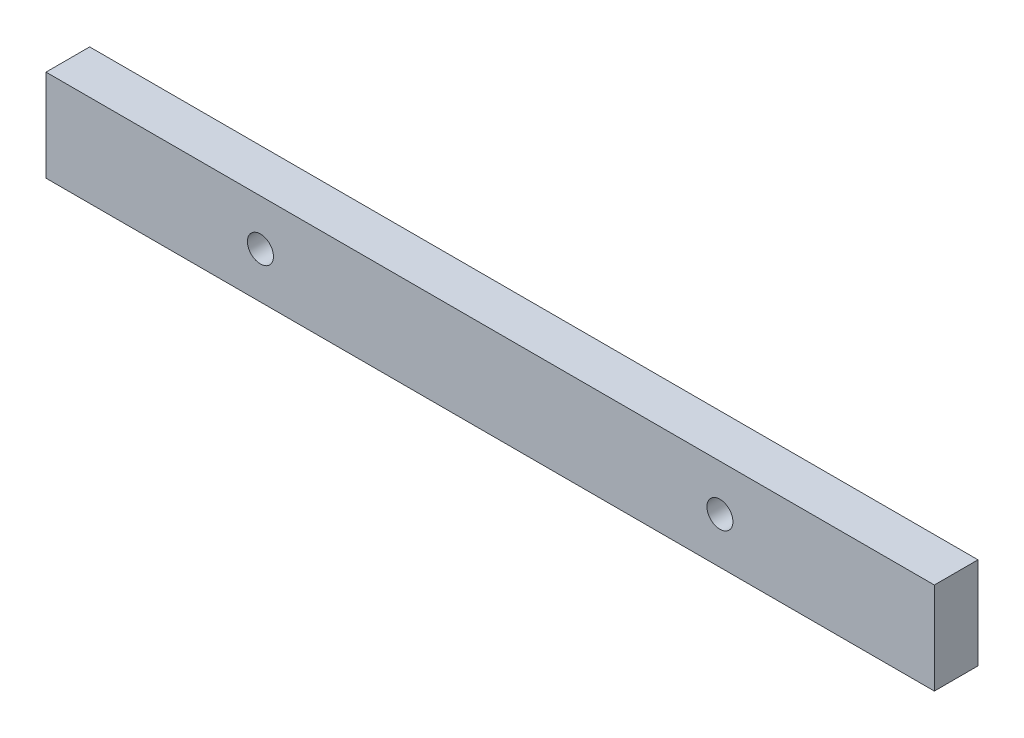
ISO-10303-21;
HEADER;
FILE_DESCRIPTION(('STEP AP214'),'2;1');
FILE_NAME('part.step','',(''),(''),'','','');
FILE_SCHEMA(('AUTOMOTIVE_DESIGN { 1 0 10303 214 1 1 1 1 }'));
ENDSEC;
DATA;
#1=APPLICATION_CONTEXT('core data for automotive mechanical design processes');
#2=APPLICATION_PROTOCOL_DEFINITION('international standard','automotive_design',2000,#1);
#3=PRODUCT_CONTEXT('',#1,'mechanical');
#4=PRODUCT('Part','Part','',(#3));
#5=PRODUCT_RELATED_PRODUCT_CATEGORY('part','',(#4));
#6=PRODUCT_DEFINITION_FORMATION('','',#4);
#7=PRODUCT_DEFINITION_CONTEXT('part definition',#1,'design');
#8=PRODUCT_DEFINITION('design','',#6,#7);
#9=PRODUCT_DEFINITION_SHAPE('','',#8);
#10=(LENGTH_UNIT() NAMED_UNIT(*) SI_UNIT(.MILLI.,.METRE.));
#11=(NAMED_UNIT(*) PLANE_ANGLE_UNIT() SI_UNIT($,.RADIAN.));
#12=(NAMED_UNIT(*) SI_UNIT($,.STERADIAN.) SOLID_ANGLE_UNIT());
#13=UNCERTAINTY_MEASURE_WITH_UNIT(LENGTH_MEASURE(1.E-05),#10,'distance_accuracy_value','');
#14=(GEOMETRIC_REPRESENTATION_CONTEXT(3) GLOBAL_UNCERTAINTY_ASSIGNED_CONTEXT((#13)) GLOBAL_UNIT_ASSIGNED_CONTEXT((#10,
#11,#12)) REPRESENTATION_CONTEXT('',''));
#15=CARTESIAN_POINT('',(0.,0.,0.));
#16=DIRECTION('',(0.,0.,1.));
#17=DIRECTION('',(1.,0.,0.));
#18=AXIS2_PLACEMENT_3D('',#15,#16,#17);
#19=CARTESIAN_POINT('',(29.,3.,2.85));
#20=DIRECTION('',(-1.,0.,0.));
#21=DIRECTION('',(0.,0.,1.));
#22=AXIS2_PLACEMENT_3D('',#19,#20,#21);
#23=PLANE('',#22);
#24=DIRECTION('',(0.,1.,0.));
#25=VECTOR('',#24,1.);
#26=CARTESIAN_POINT('',(29.,3.,0.));
#27=LINE('',#26,#25);
#28=CARTESIAN_POINT('',(29.,-3.,0.));
#29=VERTEX_POINT('',#28);
#30=CARTESIAN_POINT('',(29.,3.,0.));
#31=VERTEX_POINT('',#30);
#32=EDGE_CURVE('E98',#29,#31,#27,.T.);
#33=ORIENTED_EDGE('',*,*,#32,.T.);
#34=DIRECTION('',(0.,0.,-1.));
#35=VECTOR('',#34,1.);
#36=CARTESIAN_POINT('',(29.,3.,2.85));
#37=LINE('',#36,#35);
#38=CARTESIAN_POINT('',(29.,3.,2.85));
#39=VERTEX_POINT('',#38);
#40=EDGE_CURVE('E11',#39,#31,#37,.T.);
#41=ORIENTED_EDGE('',*,*,#40,.F.);
#42=DIRECTION('',(0.,1.,0.));
#43=VECTOR('',#42,1.);
#44=CARTESIAN_POINT('',(29.,3.,2.85));
#45=LINE('',#44,#43);
#46=CARTESIAN_POINT('',(29.,-3.,2.85));
#47=VERTEX_POINT('',#46);
#48=EDGE_CURVE('E86',#47,#39,#45,.T.);
#49=ORIENTED_EDGE('',*,*,#48,.F.);
#50=DIRECTION('',(0.,0.,-1.));
#51=VECTOR('',#50,1.);
#52=CARTESIAN_POINT('',(29.,-3.,2.85));
#53=LINE('',#52,#51);
#54=EDGE_CURVE('E94',#47,#29,#53,.T.);
#55=ORIENTED_EDGE('',*,*,#54,.T.);
#56=EDGE_LOOP('',(#33,#41,#49,#55));
#57=FACE_BOUND('',#56,.T.);
#58=ADVANCED_FACE('F35',(#57),#23,.F.);
#59=CARTESIAN_POINT('',(-29.,3.,2.85));
#60=DIRECTION('',(0.,-1.,0.));
#61=DIRECTION('',(0.,0.,-1.));
#62=AXIS2_PLACEMENT_3D('',#59,#60,#61);
#63=PLANE('',#62);
#64=DIRECTION('',(-1.,0.,0.));
#65=VECTOR('',#64,1.);
#66=CARTESIAN_POINT('',(-29.,3.,0.));
#67=LINE('',#66,#65);
#68=CARTESIAN_POINT('',(-29.,3.,0.));
#69=VERTEX_POINT('',#68);
#70=EDGE_CURVE('E90',#31,#69,#67,.T.);
#71=ORIENTED_EDGE('',*,*,#70,.T.);
#72=DIRECTION('',(0.,0.,-1.));
#73=VECTOR('',#72,1.);
#74=CARTESIAN_POINT('',(-29.,3.,2.85));
#75=LINE('',#74,#73);
#76=CARTESIAN_POINT('',(-29.,3.,2.85));
#77=VERTEX_POINT('',#76);
#78=EDGE_CURVE('E43',#77,#69,#75,.T.);
#79=ORIENTED_EDGE('',*,*,#78,.F.);
#80=DIRECTION('',(-1.,0.,0.));
#81=VECTOR('',#80,1.);
#82=CARTESIAN_POINT('',(-29.,3.,2.85));
#83=LINE('',#82,#81);
#84=EDGE_CURVE('E81',#39,#77,#83,.T.);
#85=ORIENTED_EDGE('',*,*,#84,.F.);
#86=ORIENTED_EDGE('',*,*,#40,.T.);
#87=EDGE_LOOP('',(#71,#79,#85,#86));
#88=FACE_BOUND('',#87,.T.);
#89=ADVANCED_FACE('F89',(#88),#63,.F.);
#90=CARTESIAN_POINT('',(-29.,3.,2.85));
#91=DIRECTION('',(1.,0.,0.));
#92=DIRECTION('',(0.,0.,-1.));
#93=AXIS2_PLACEMENT_3D('',#90,#91,#92);
#94=PLANE('',#93);
#95=DIRECTION('',(0.,-1.,0.));
#96=VECTOR('',#95,1.);
#97=CARTESIAN_POINT('',(-29.,3.,0.));
#98=LINE('',#97,#96);
#99=CARTESIAN_POINT('',(-29.,-3.,0.));
#100=VERTEX_POINT('',#99);
#101=EDGE_CURVE('E68',#69,#100,#98,.T.);
#102=ORIENTED_EDGE('',*,*,#101,.T.);
#103=DIRECTION('',(0.,0.,-1.));
#104=VECTOR('',#103,1.);
#105=CARTESIAN_POINT('',(-29.,-3.,2.85));
#106=LINE('',#105,#104);
#107=CARTESIAN_POINT('',(-29.,-3.,2.85));
#108=VERTEX_POINT('',#107);
#109=EDGE_CURVE('E91',#108,#100,#106,.T.);
#110=ORIENTED_EDGE('',*,*,#109,.F.);
#111=DIRECTION('',(0.,-1.,0.));
#112=VECTOR('',#111,1.);
#113=CARTESIAN_POINT('',(-29.,3.,2.85));
#114=LINE('',#113,#112);
#115=EDGE_CURVE('E84',#77,#108,#114,.T.);
#116=ORIENTED_EDGE('',*,*,#115,.F.);
#117=ORIENTED_EDGE('',*,*,#78,.T.);
#118=EDGE_LOOP('',(#102,#110,#116,#117));
#119=FACE_BOUND('',#118,.T.);
#120=ADVANCED_FACE('F92',(#119),#94,.F.);
#121=CARTESIAN_POINT('',(-29.,-3.,2.85));
#122=DIRECTION('',(0.,1.,0.));
#123=DIRECTION('',(0.,0.,1.));
#124=AXIS2_PLACEMENT_3D('',#121,#122,#123);
#125=PLANE('',#124);
#126=DIRECTION('',(1.,0.,0.));
#127=VECTOR('',#126,1.);
#128=CARTESIAN_POINT('',(-29.,-3.,0.));
#129=LINE('',#128,#127);
#130=EDGE_CURVE('E74',#100,#29,#129,.T.);
#131=ORIENTED_EDGE('',*,*,#130,.T.);
#132=ORIENTED_EDGE('',*,*,#54,.F.);
#133=DIRECTION('',(1.,0.,0.));
#134=VECTOR('',#133,1.);
#135=CARTESIAN_POINT('',(-29.,-3.,2.85));
#136=LINE('',#135,#134);
#137=EDGE_CURVE('E51',#108,#47,#136,.T.);
#138=ORIENTED_EDGE('',*,*,#137,.F.);
#139=ORIENTED_EDGE('',*,*,#109,.T.);
#140=EDGE_LOOP('',(#131,#132,#138,#139));
#141=FACE_BOUND('',#140,.T.);
#142=ADVANCED_FACE('F106',(#141),#125,.F.);
#143=CARTESIAN_POINT('',(0.,0.,2.85));
#144=DIRECTION('',(0.,0.,1.));
#145=DIRECTION('',(1.,0.,0.));
#146=AXIS2_PLACEMENT_3D('',#143,#144,#145);
#147=PLANE('',#146);
#148=CARTESIAN_POINT('',(-15.,0.,2.85));
#149=DIRECTION('',(0.,0.,1.));
#150=DIRECTION('',(1.,0.,0.));
#151=AXIS2_PLACEMENT_3D('',#148,#149,#150);
#152=CIRCLE('',#151,0.849442743317933);
#153=CARTESIAN_POINT('',(-14.1505572566821,0.,2.85));
#154=VERTEX_POINT('',#153);
#155=EDGE_CURVE('E118',#154,#154,#152,.T.);
#156=ORIENTED_EDGE('',*,*,#155,.F.);
#157=EDGE_LOOP('',(#156));
#158=FACE_BOUND('',#157,.T.);
#159=CARTESIAN_POINT('',(15.,0.,2.85));
#160=DIRECTION('',(0.,0.,1.));
#161=DIRECTION('',(1.,0.,0.));
#162=AXIS2_PLACEMENT_3D('',#159,#160,#161);
#163=CIRCLE('',#162,0.849442743317933);
#164=CARTESIAN_POINT('',(15.8494427433179,0.,2.85));
#165=VERTEX_POINT('',#164);
#166=EDGE_CURVE('E112',#165,#165,#163,.T.);
#167=ORIENTED_EDGE('',*,*,#166,.F.);
#168=EDGE_LOOP('',(#167));
#169=FACE_BOUND('',#168,.T.);
#170=ORIENTED_EDGE('',*,*,#48,.T.);
#171=ORIENTED_EDGE('',*,*,#84,.T.);
#172=ORIENTED_EDGE('',*,*,#115,.T.);
#173=ORIENTED_EDGE('',*,*,#137,.T.);
#174=EDGE_LOOP('',(#170,#171,#172,#173));
#175=FACE_BOUND('',#174,.T.);
#176=ADVANCED_FACE('F82',(#158,#169,#175),#147,.T.);
#177=CARTESIAN_POINT('',(0.,0.,0.));
#178=DIRECTION('',(0.,0.,1.));
#179=DIRECTION('',(1.,0.,0.));
#180=AXIS2_PLACEMENT_3D('',#177,#178,#179);
#181=PLANE('',#180);
#182=CARTESIAN_POINT('',(-15.,0.,0.));
#183=DIRECTION('',(0.,0.,1.));
#184=DIRECTION('',(1.,0.,0.));
#185=AXIS2_PLACEMENT_3D('',#182,#183,#184);
#186=CIRCLE('',#185,0.849442743317933);
#187=CARTESIAN_POINT('',(-14.1505572566821,0.,0.));
#188=VERTEX_POINT('',#187);
#189=EDGE_CURVE('E115',#188,#188,#186,.T.);
#190=ORIENTED_EDGE('',*,*,#189,.T.);
#191=EDGE_LOOP('',(#190));
#192=FACE_BOUND('',#191,.T.);
#193=CARTESIAN_POINT('',(15.,0.,0.));
#194=DIRECTION('',(0.,0.,1.));
#195=DIRECTION('',(1.,0.,0.));
#196=AXIS2_PLACEMENT_3D('',#193,#194,#195);
#197=CIRCLE('',#196,0.849442743317933);
#198=CARTESIAN_POINT('',(15.8494427433179,0.,0.));
#199=VERTEX_POINT('',#198);
#200=EDGE_CURVE('E101',#199,#199,#197,.T.);
#201=ORIENTED_EDGE('',*,*,#200,.T.);
#202=EDGE_LOOP('',(#201));
#203=FACE_BOUND('',#202,.T.);
#204=ORIENTED_EDGE('',*,*,#32,.F.);
#205=ORIENTED_EDGE('',*,*,#130,.F.);
#206=ORIENTED_EDGE('',*,*,#101,.F.);
#207=ORIENTED_EDGE('',*,*,#70,.F.);
#208=EDGE_LOOP('',(#204,#205,#206,#207));
#209=FACE_BOUND('',#208,.T.);
#210=ADVANCED_FACE('F109',(#192,#203,#209),#181,.F.);
#211=CARTESIAN_POINT('',(15.,0.,0.));
#212=DIRECTION('',(0.,0.,1.));
#213=DIRECTION('',(1.,0.,0.));
#214=AXIS2_PLACEMENT_3D('',#211,#212,#213);
#215=CYLINDRICAL_SURFACE('',#214,0.849442743317933);
#216=ORIENTED_EDGE('',*,*,#200,.F.);
#217=EDGE_LOOP('',(#216));
#218=FACE_BOUND('',#217,.T.);
#219=ORIENTED_EDGE('',*,*,#166,.T.);
#220=EDGE_LOOP('',(#219));
#221=FACE_BOUND('',#220,.T.);
#222=ADVANCED_FACE('F129',(#218,#221),#215,.F.);
#223=CARTESIAN_POINT('',(-15.,0.,0.));
#224=DIRECTION('',(0.,0.,1.));
#225=DIRECTION('',(1.,0.,0.));
#226=AXIS2_PLACEMENT_3D('',#223,#224,#225);
#227=CYLINDRICAL_SURFACE('',#226,0.849442743317933);
#228=ORIENTED_EDGE('',*,*,#189,.F.);
#229=EDGE_LOOP('',(#228));
#230=FACE_BOUND('',#229,.T.);
#231=ORIENTED_EDGE('',*,*,#155,.T.);
#232=EDGE_LOOP('',(#231));
#233=FACE_BOUND('',#232,.T.);
#234=ADVANCED_FACE('F126',(#230,#233),#227,.F.);
#235=CLOSED_SHELL('',(#58,#89,#120,#142,#176,#210,#222,#234));
#236=MANIFOLD_SOLID_BREP('B2',#235);
#237=ADVANCED_BREP_SHAPE_REPRESENTATION('',(#18,#236),#14);
#238=SHAPE_DEFINITION_REPRESENTATION(#9,#237);
ENDSEC;
END-ISO-10303-21;
